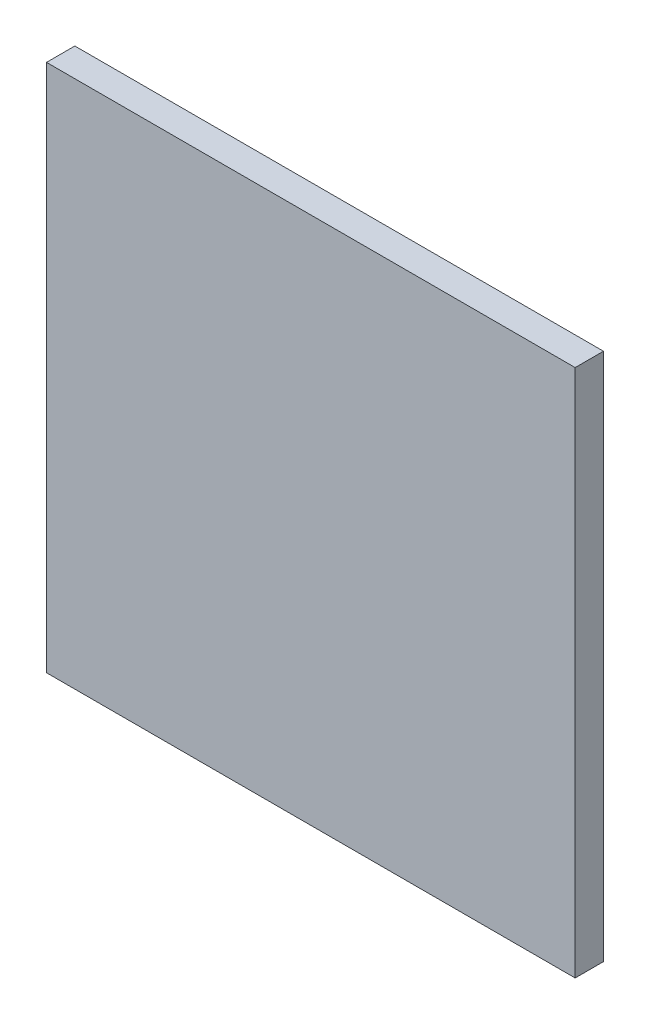
ISO-10303-21;
HEADER;
FILE_DESCRIPTION(('STEP AP214'),'2;1');
FILE_NAME('part.step','',(''),(''),'','','');
FILE_SCHEMA(('AUTOMOTIVE_DESIGN { 1 0 10303 214 1 1 1 1 }'));
ENDSEC;
DATA;
#1=APPLICATION_CONTEXT('core data for automotive mechanical design processes');
#2=APPLICATION_PROTOCOL_DEFINITION('international standard','automotive_design',2000,#1);
#3=PRODUCT_CONTEXT('',#1,'mechanical');
#4=PRODUCT('Part','Part','',(#3));
#5=PRODUCT_RELATED_PRODUCT_CATEGORY('part','',(#4));
#6=PRODUCT_DEFINITION_FORMATION('','',#4);
#7=PRODUCT_DEFINITION_CONTEXT('part definition',#1,'design');
#8=PRODUCT_DEFINITION('design','',#6,#7);
#9=PRODUCT_DEFINITION_SHAPE('','',#8);
#10=(LENGTH_UNIT() NAMED_UNIT(*) SI_UNIT(.MILLI.,.METRE.));
#11=(NAMED_UNIT(*) PLANE_ANGLE_UNIT() SI_UNIT($,.RADIAN.));
#12=(NAMED_UNIT(*) SI_UNIT($,.STERADIAN.) SOLID_ANGLE_UNIT());
#13=UNCERTAINTY_MEASURE_WITH_UNIT(LENGTH_MEASURE(1.E-05),#10,'distance_accuracy_value','');
#14=(GEOMETRIC_REPRESENTATION_CONTEXT(3) GLOBAL_UNCERTAINTY_ASSIGNED_CONTEXT((#13)) GLOBAL_UNIT_ASSIGNED_CONTEXT((#10,
#11,#12)) REPRESENTATION_CONTEXT('',''));
#15=CARTESIAN_POINT('',(0.,0.,0.));
#16=DIRECTION('',(0.,0.,1.));
#17=DIRECTION('',(1.,0.,0.));
#18=AXIS2_PLACEMENT_3D('',#15,#16,#17);
#19=CARTESIAN_POINT('',(-136.69,-94.,1.5));
#20=DIRECTION('',(0.,1.,0.));
#21=DIRECTION('',(0.,0.,1.));
#22=AXIS2_PLACEMENT_3D('',#19,#20,#21);
#23=PLANE('',#22);
#24=DIRECTION('',(1.,0.,0.));
#25=VECTOR('',#24,1.);
#26=CARTESIAN_POINT('',(-136.69,-94.,0.));
#27=LINE('',#26,#25);
#28=CARTESIAN_POINT('',(-136.69,-94.,0.));
#29=VERTEX_POINT('',#28);
#30=CARTESIAN_POINT('',(-108.69,-94.,0.));
#31=VERTEX_POINT('',#30);
#32=EDGE_CURVE('E104',#29,#31,#27,.T.);
#33=ORIENTED_EDGE('',*,*,#32,.T.);
#34=DIRECTION('',(0.,0.,-1.));
#35=VECTOR('',#34,1.);
#36=CARTESIAN_POINT('',(-108.69,-94.,1.5));
#37=LINE('',#36,#35);
#38=CARTESIAN_POINT('',(-108.69,-94.,1.5));
#39=VERTEX_POINT('',#38);
#40=EDGE_CURVE('E11',#39,#31,#37,.T.);
#41=ORIENTED_EDGE('',*,*,#40,.F.);
#42=DIRECTION('',(1.,0.,0.));
#43=VECTOR('',#42,1.);
#44=CARTESIAN_POINT('',(-136.69,-94.,1.5));
#45=LINE('',#44,#43);
#46=CARTESIAN_POINT('',(-136.69,-94.,1.5));
#47=VERTEX_POINT('',#46);
#48=EDGE_CURVE('E92',#47,#39,#45,.T.);
#49=ORIENTED_EDGE('',*,*,#48,.F.);
#50=DIRECTION('',(0.,0.,-1.));
#51=VECTOR('',#50,1.);
#52=CARTESIAN_POINT('',(-136.69,-94.,1.5));
#53=LINE('',#52,#51);
#54=EDGE_CURVE('E100',#47,#29,#53,.T.);
#55=ORIENTED_EDGE('',*,*,#54,.T.);
#56=EDGE_LOOP('',(#33,#41,#49,#55));
#57=FACE_BOUND('',#56,.T.);
#58=ADVANCED_FACE('F41',(#57),#23,.F.);
#59=CARTESIAN_POINT('',(-108.69,-94.,1.5));
#60=DIRECTION('',(-1.,0.,0.));
#61=DIRECTION('',(0.,0.,1.));
#62=AXIS2_PLACEMENT_3D('',#59,#60,#61);
#63=PLANE('',#62);
#64=DIRECTION('',(0.,1.,0.));
#65=VECTOR('',#64,1.);
#66=CARTESIAN_POINT('',(-108.69,-94.,0.));
#67=LINE('',#66,#65);
#68=CARTESIAN_POINT('',(-108.69,-66.,0.));
#69=VERTEX_POINT('',#68);
#70=EDGE_CURVE('E96',#31,#69,#67,.T.);
#71=ORIENTED_EDGE('',*,*,#70,.T.);
#72=DIRECTION('',(0.,0.,-1.));
#73=VECTOR('',#72,1.);
#74=CARTESIAN_POINT('',(-108.69,-66.,1.5));
#75=LINE('',#74,#73);
#76=CARTESIAN_POINT('',(-108.69,-66.,1.5));
#77=VERTEX_POINT('',#76);
#78=EDGE_CURVE('E49',#77,#69,#75,.T.);
#79=ORIENTED_EDGE('',*,*,#78,.F.);
#80=DIRECTION('',(0.,1.,0.));
#81=VECTOR('',#80,1.);
#82=CARTESIAN_POINT('',(-108.69,-94.,1.5));
#83=LINE('',#82,#81);
#84=EDGE_CURVE('E87',#39,#77,#83,.T.);
#85=ORIENTED_EDGE('',*,*,#84,.F.);
#86=ORIENTED_EDGE('',*,*,#40,.T.);
#87=EDGE_LOOP('',(#71,#79,#85,#86));
#88=FACE_BOUND('',#87,.T.);
#89=ADVANCED_FACE('F95',(#88),#63,.F.);
#90=CARTESIAN_POINT('',(-108.69,-66.,1.5));
#91=DIRECTION('',(0.,-1.,0.));
#92=DIRECTION('',(0.,0.,-1.));
#93=AXIS2_PLACEMENT_3D('',#90,#91,#92);
#94=PLANE('',#93);
#95=DIRECTION('',(-1.,0.,0.));
#96=VECTOR('',#95,1.);
#97=CARTESIAN_POINT('',(-108.69,-66.,0.));
#98=LINE('',#97,#96);
#99=CARTESIAN_POINT('',(-136.69,-66.,0.));
#100=VERTEX_POINT('',#99);
#101=EDGE_CURVE('E74',#69,#100,#98,.T.);
#102=ORIENTED_EDGE('',*,*,#101,.T.);
#103=DIRECTION('',(0.,0.,-1.));
#104=VECTOR('',#103,1.);
#105=CARTESIAN_POINT('',(-136.69,-66.,1.5));
#106=LINE('',#105,#104);
#107=CARTESIAN_POINT('',(-136.69,-66.,1.5));
#108=VERTEX_POINT('',#107);
#109=EDGE_CURVE('E97',#108,#100,#106,.T.);
#110=ORIENTED_EDGE('',*,*,#109,.F.);
#111=DIRECTION('',(-1.,0.,0.));
#112=VECTOR('',#111,1.);
#113=CARTESIAN_POINT('',(-108.69,-66.,1.5));
#114=LINE('',#113,#112);
#115=EDGE_CURVE('E90',#77,#108,#114,.T.);
#116=ORIENTED_EDGE('',*,*,#115,.F.);
#117=ORIENTED_EDGE('',*,*,#78,.T.);
#118=EDGE_LOOP('',(#102,#110,#116,#117));
#119=FACE_BOUND('',#118,.T.);
#120=ADVANCED_FACE('F98',(#119),#94,.F.);
#121=CARTESIAN_POINT('',(-136.69,-66.,1.5));
#122=DIRECTION('',(1.,0.,0.));
#123=DIRECTION('',(0.,0.,-1.));
#124=AXIS2_PLACEMENT_3D('',#121,#122,#123);
#125=PLANE('',#124);
#126=DIRECTION('',(0.,-1.,0.));
#127=VECTOR('',#126,1.);
#128=CARTESIAN_POINT('',(-136.69,-66.,0.));
#129=LINE('',#128,#127);
#130=EDGE_CURVE('E80',#100,#29,#129,.T.);
#131=ORIENTED_EDGE('',*,*,#130,.T.);
#132=ORIENTED_EDGE('',*,*,#54,.F.);
#133=DIRECTION('',(0.,-1.,0.));
#134=VECTOR('',#133,1.);
#135=CARTESIAN_POINT('',(-136.69,-66.,1.5));
#136=LINE('',#135,#134);
#137=EDGE_CURVE('E57',#108,#47,#136,.T.);
#138=ORIENTED_EDGE('',*,*,#137,.F.);
#139=ORIENTED_EDGE('',*,*,#109,.T.);
#140=EDGE_LOOP('',(#131,#132,#138,#139));
#141=FACE_BOUND('',#140,.T.);
#142=ADVANCED_FACE('F111',(#141),#125,.F.);
#143=CARTESIAN_POINT('',(-108.69,-94.,1.5));
#144=DIRECTION('',(0.,0.,1.));
#145=DIRECTION('',(1.,0.,0.));
#146=AXIS2_PLACEMENT_3D('',#143,#144,#145);
#147=PLANE('',#146);
#148=ORIENTED_EDGE('',*,*,#48,.T.);
#149=ORIENTED_EDGE('',*,*,#84,.T.);
#150=ORIENTED_EDGE('',*,*,#115,.T.);
#151=ORIENTED_EDGE('',*,*,#137,.T.);
#152=EDGE_LOOP('',(#148,#149,#150,#151));
#153=FACE_BOUND('',#152,.T.);
#154=ADVANCED_FACE('F88',(#153),#147,.T.);
#155=CARTESIAN_POINT('',(-108.69,-94.,0.));
#156=DIRECTION('',(0.,0.,1.));
#157=DIRECTION('',(1.,0.,0.));
#158=AXIS2_PLACEMENT_3D('',#155,#156,#157);
#159=PLANE('',#158);
#160=ORIENTED_EDGE('',*,*,#32,.F.);
#161=ORIENTED_EDGE('',*,*,#130,.F.);
#162=ORIENTED_EDGE('',*,*,#101,.F.);
#163=ORIENTED_EDGE('',*,*,#70,.F.);
#164=EDGE_LOOP('',(#160,#161,#162,#163));
#165=FACE_BOUND('',#164,.T.);
#166=ADVANCED_FACE('F114',(#165),#159,.F.);
#167=CLOSED_SHELL('',(#58,#89,#120,#142,#154,#166));
#168=MANIFOLD_SOLID_BREP('B2',#167);
#169=ADVANCED_BREP_SHAPE_REPRESENTATION('',(#18,#168),#14);
#170=SHAPE_DEFINITION_REPRESENTATION(#9,#169);
ENDSEC;
END-ISO-10303-21;
